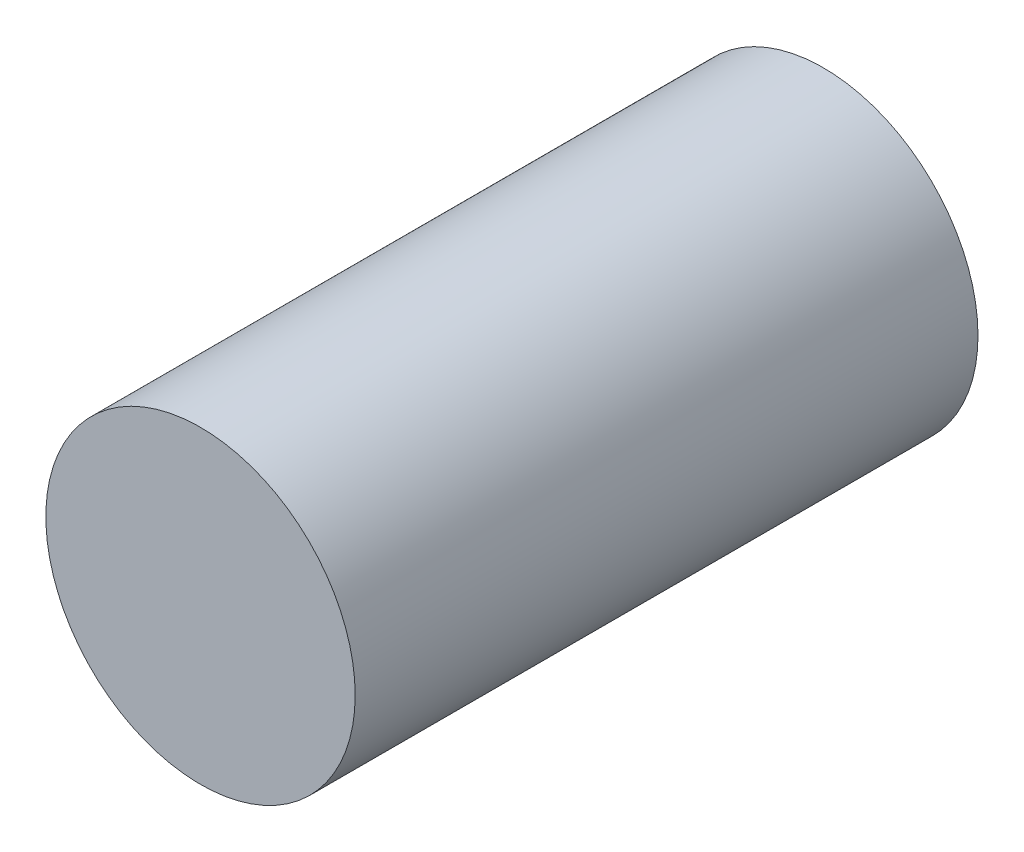
ISO-10303-21;
HEADER;
FILE_DESCRIPTION(('STEP AP214'),'2;1');
FILE_NAME('part.step','',(''),(''),'','','');
FILE_SCHEMA(('AUTOMOTIVE_DESIGN { 1 0 10303 214 1 1 1 1 }'));
ENDSEC;
DATA;
#1=APPLICATION_CONTEXT('core data for automotive mechanical design processes');
#2=APPLICATION_PROTOCOL_DEFINITION('international standard','automotive_design',2000,#1);
#3=PRODUCT_CONTEXT('',#1,'mechanical');
#4=PRODUCT('Part','Part','',(#3));
#5=PRODUCT_RELATED_PRODUCT_CATEGORY('part','',(#4));
#6=PRODUCT_DEFINITION_FORMATION('','',#4);
#7=PRODUCT_DEFINITION_CONTEXT('part definition',#1,'design');
#8=PRODUCT_DEFINITION('design','',#6,#7);
#9=PRODUCT_DEFINITION_SHAPE('','',#8);
#10=(LENGTH_UNIT() NAMED_UNIT(*) SI_UNIT(.MILLI.,.METRE.));
#11=(NAMED_UNIT(*) PLANE_ANGLE_UNIT() SI_UNIT($,.RADIAN.));
#12=(NAMED_UNIT(*) SI_UNIT($,.STERADIAN.) SOLID_ANGLE_UNIT());
#13=UNCERTAINTY_MEASURE_WITH_UNIT(LENGTH_MEASURE(1.E-05),#10,'distance_accuracy_value','');
#14=(GEOMETRIC_REPRESENTATION_CONTEXT(3) GLOBAL_UNCERTAINTY_ASSIGNED_CONTEXT((#13)) GLOBAL_UNIT_ASSIGNED_CONTEXT((#10,
#11,#12)) REPRESENTATION_CONTEXT('',''));
#15=CARTESIAN_POINT('',(0.,0.,0.));
#16=DIRECTION('',(0.,0.,1.));
#17=DIRECTION('',(1.,0.,0.));
#18=AXIS2_PLACEMENT_3D('',#15,#16,#17);
#19=CARTESIAN_POINT('',(-11.1078272790282,4.13546465434112,30.));
#20=DIRECTION('',(0.,0.,-1.));
#21=DIRECTION('',(-1.,0.,0.));
#22=AXIS2_PLACEMENT_3D('',#19,#20,#21);
#23=CYLINDRICAL_SURFACE('',#22,7.45);
#24=CARTESIAN_POINT('',(-11.1078272790282,4.13546465434112,30.));
#25=DIRECTION('',(0.,0.,1.));
#26=DIRECTION('',(1.,0.,0.));
#27=AXIS2_PLACEMENT_3D('',#24,#25,#26);
#28=CIRCLE('',#27,7.45);
#29=CARTESIAN_POINT('',(-3.65782727902822,4.13546465434112,30.));
#30=VERTEX_POINT('',#29);
#31=EDGE_CURVE('E10',#30,#30,#28,.T.);
#32=ORIENTED_EDGE('',*,*,#31,.F.);
#33=EDGE_LOOP('',(#32));
#34=FACE_BOUND('',#33,.T.);
#35=CARTESIAN_POINT('',(-11.1078272790282,4.13546465434112,0.));
#36=DIRECTION('',(0.,0.,1.));
#37=DIRECTION('',(1.,0.,0.));
#38=AXIS2_PLACEMENT_3D('',#35,#36,#37);
#39=CIRCLE('',#38,7.45);
#40=CARTESIAN_POINT('',(-3.65782727902822,4.13546465434112,0.));
#41=VERTEX_POINT('',#40);
#42=EDGE_CURVE('E40',#41,#41,#39,.T.);
#43=ORIENTED_EDGE('',*,*,#42,.T.);
#44=EDGE_LOOP('',(#43));
#45=FACE_BOUND('',#44,.T.);
#46=ADVANCED_FACE('F37',(#34,#45),#23,.T.);
#47=CARTESIAN_POINT('',(-11.1078272790282,4.13546465434112,30.));
#48=DIRECTION('',(0.,0.,1.));
#49=DIRECTION('',(1.,0.,0.));
#50=AXIS2_PLACEMENT_3D('',#47,#48,#49);
#51=PLANE('',#50);
#52=ORIENTED_EDGE('',*,*,#31,.T.);
#53=EDGE_LOOP('',(#52));
#54=FACE_BOUND('',#53,.T.);
#55=ADVANCED_FACE('F52',(#54),#51,.T.);
#56=CARTESIAN_POINT('',(-11.1078272790282,4.13546465434112,0.));
#57=DIRECTION('',(0.,0.,1.));
#58=DIRECTION('',(1.,0.,0.));
#59=AXIS2_PLACEMENT_3D('',#56,#57,#58);
#60=PLANE('',#59);
#61=ORIENTED_EDGE('',*,*,#42,.F.);
#62=EDGE_LOOP('',(#61));
#63=FACE_BOUND('',#62,.T.);
#64=ADVANCED_FACE('F50',(#63),#60,.F.);
#65=CLOSED_SHELL('',(#46,#55,#64));
#66=MANIFOLD_SOLID_BREP('B2',#65);
#67=ADVANCED_BREP_SHAPE_REPRESENTATION('',(#18,#66),#14);
#68=SHAPE_DEFINITION_REPRESENTATION(#9,#67);
ENDSEC;
END-ISO-10303-21;
